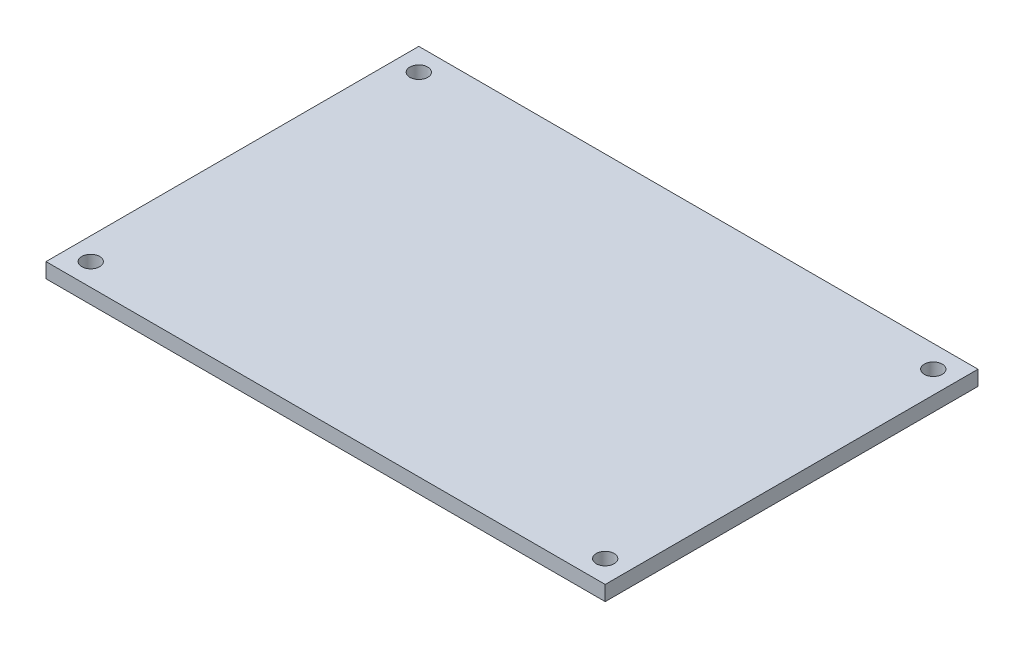
ISO-10303-21;
HEADER;
FILE_DESCRIPTION(('STEP AP214'),'2;1');
FILE_NAME('part.step','',(''),(''),'','','');
FILE_SCHEMA(('AUTOMOTIVE_DESIGN { 1 0 10303 214 1 1 1 1 }'));
ENDSEC;
DATA;
#1=APPLICATION_CONTEXT('core data for automotive mechanical design processes');
#2=APPLICATION_PROTOCOL_DEFINITION('international standard','automotive_design',2000,#1);
#3=PRODUCT_CONTEXT('',#1,'mechanical');
#4=PRODUCT('Part','Part','',(#3));
#5=PRODUCT_RELATED_PRODUCT_CATEGORY('part','',(#4));
#6=PRODUCT_DEFINITION_FORMATION('','',#4);
#7=PRODUCT_DEFINITION_CONTEXT('part definition',#1,'design');
#8=PRODUCT_DEFINITION('design','',#6,#7);
#9=PRODUCT_DEFINITION_SHAPE('','',#8);
#10=(LENGTH_UNIT() NAMED_UNIT(*) SI_UNIT(.MILLI.,.METRE.));
#11=(NAMED_UNIT(*) PLANE_ANGLE_UNIT() SI_UNIT($,.RADIAN.));
#12=(NAMED_UNIT(*) SI_UNIT($,.STERADIAN.) SOLID_ANGLE_UNIT());
#13=UNCERTAINTY_MEASURE_WITH_UNIT(LENGTH_MEASURE(1.E-05),#10,'distance_accuracy_value','');
#14=(GEOMETRIC_REPRESENTATION_CONTEXT(3) GLOBAL_UNCERTAINTY_ASSIGNED_CONTEXT((#13)) GLOBAL_UNIT_ASSIGNED_CONTEXT((#10,
#11,#12)) REPRESENTATION_CONTEXT('',''));
#15=CARTESIAN_POINT('',(0.,0.,0.));
#16=DIRECTION('',(0.,0.,1.));
#17=DIRECTION('',(1.,0.,0.));
#18=AXIS2_PLACEMENT_3D('',#15,#16,#17);
#19=CARTESIAN_POINT('',(0.,10.,0.));
#20=DIRECTION('',(0.,1.,0.));
#21=DIRECTION('',(0.,0.,1.));
#22=AXIS2_PLACEMENT_3D('',#19,#20,#21);
#23=PLANE('',#22);
#24=CARTESIAN_POINT('',(360.,10.,235.));
#25=DIRECTION('',(0.,1.,0.));
#26=DIRECTION('',(0.,0.,-1.));
#27=AXIS2_PLACEMENT_3D('',#24,#25,#26);
#28=CIRCLE('',#27,5.99999999999999);
#29=CARTESIAN_POINT('',(360.,10.,229.));
#30=VERTEX_POINT('',#29);
#31=EDGE_CURVE('E142',#30,#30,#28,.T.);
#32=ORIENTED_EDGE('',*,*,#31,.F.);
#33=EDGE_LOOP('',(#32));
#34=FACE_BOUND('',#33,.T.);
#35=CARTESIAN_POINT('',(360.,10.,15.));
#36=DIRECTION('',(0.,1.,0.));
#37=DIRECTION('',(0.,0.,1.));
#38=AXIS2_PLACEMENT_3D('',#35,#36,#37);
#39=CIRCLE('',#38,5.99999999999999);
#40=CARTESIAN_POINT('',(360.,10.,21.));
#41=VERTEX_POINT('',#40);
#42=EDGE_CURVE('E112',#41,#41,#39,.T.);
#43=ORIENTED_EDGE('',*,*,#42,.F.);
#44=EDGE_LOOP('',(#43));
#45=FACE_BOUND('',#44,.T.);
#46=DIRECTION('',(0.,0.,1.));
#47=VECTOR('',#46,1.);
#48=CARTESIAN_POINT('',(0.,10.,0.));
#49=LINE('',#48,#47);
#50=CARTESIAN_POINT('',(0.,10.,0.));
#51=VERTEX_POINT('',#50);
#52=CARTESIAN_POINT('',(0.,10.,250.));
#53=VERTEX_POINT('',#52);
#54=EDGE_CURVE('E92',#51,#53,#49,.T.);
#55=ORIENTED_EDGE('',*,*,#54,.T.);
#56=DIRECTION('',(1.,0.,0.));
#57=VECTOR('',#56,1.);
#58=CARTESIAN_POINT('',(0.,10.,250.));
#59=LINE('',#58,#57);
#60=CARTESIAN_POINT('',(375.,10.,250.));
#61=VERTEX_POINT('',#60);
#62=EDGE_CURVE('E87',#53,#61,#59,.T.);
#63=ORIENTED_EDGE('',*,*,#62,.T.);
#64=DIRECTION('',(0.,0.,-1.));
#65=VECTOR('',#64,1.);
#66=CARTESIAN_POINT('',(375.,10.,0.));
#67=LINE('',#66,#65);
#68=CARTESIAN_POINT('',(375.,10.,0.));
#69=VERTEX_POINT('',#68);
#70=EDGE_CURVE('E90',#61,#69,#67,.T.);
#71=ORIENTED_EDGE('',*,*,#70,.T.);
#72=DIRECTION('',(-1.,0.,0.));
#73=VECTOR('',#72,1.);
#74=CARTESIAN_POINT('',(0.,10.,0.));
#75=LINE('',#74,#73);
#76=EDGE_CURVE('E57',#69,#51,#75,.T.);
#77=ORIENTED_EDGE('',*,*,#76,.T.);
#78=EDGE_LOOP('',(#55,#63,#71,#77));
#79=FACE_BOUND('',#78,.T.);
#80=CARTESIAN_POINT('',(15.,10.,15.));
#81=DIRECTION('',(0.,1.,0.));
#82=DIRECTION('',(0.,0.,-1.));
#83=AXIS2_PLACEMENT_3D('',#80,#81,#82);
#84=CIRCLE('',#83,5.99999999999999);
#85=CARTESIAN_POINT('',(15.,10.,9.00000000000005));
#86=VERTEX_POINT('',#85);
#87=EDGE_CURVE('E134',#86,#86,#84,.T.);
#88=ORIENTED_EDGE('',*,*,#87,.F.);
#89=EDGE_LOOP('',(#88));
#90=FACE_BOUND('',#89,.T.);
#91=CARTESIAN_POINT('',(15.,10.,235.));
#92=DIRECTION('',(0.,1.,0.));
#93=DIRECTION('',(0.,0.,1.));
#94=AXIS2_PLACEMENT_3D('',#91,#92,#93);
#95=CIRCLE('',#94,5.99999999999999);
#96=CARTESIAN_POINT('',(15.,10.,241.));
#97=VERTEX_POINT('',#96);
#98=EDGE_CURVE('E150',#97,#97,#95,.T.);
#99=ORIENTED_EDGE('',*,*,#98,.F.);
#100=EDGE_LOOP('',(#99));
#101=FACE_BOUND('',#100,.T.);
#102=ADVANCED_FACE('F39',(#34,#45,#79,#90,#101),#23,.T.);
#103=CARTESIAN_POINT('',(0.,0.,0.));
#104=DIRECTION('',(0.,1.,0.));
#105=DIRECTION('',(0.,0.,1.));
#106=AXIS2_PLACEMENT_3D('',#103,#104,#105);
#107=PLANE('',#106);
#108=DIRECTION('',(0.,0.,1.));
#109=VECTOR('',#108,1.);
#110=CARTESIAN_POINT('',(0.,0.,0.));
#111=LINE('',#110,#109);
#112=CARTESIAN_POINT('',(0.,0.,0.));
#113=VERTEX_POINT('',#112);
#114=CARTESIAN_POINT('',(0.,0.,250.));
#115=VERTEX_POINT('',#114);
#116=EDGE_CURVE('E108',#113,#115,#111,.T.);
#117=ORIENTED_EDGE('',*,*,#116,.F.);
#118=DIRECTION('',(-1.,0.,0.));
#119=VECTOR('',#118,1.);
#120=CARTESIAN_POINT('',(0.,0.,0.));
#121=LINE('',#120,#119);
#122=CARTESIAN_POINT('',(375.,0.,0.));
#123=VERTEX_POINT('',#122);
#124=EDGE_CURVE('E80',#123,#113,#121,.T.);
#125=ORIENTED_EDGE('',*,*,#124,.F.);
#126=DIRECTION('',(0.,0.,-1.));
#127=VECTOR('',#126,1.);
#128=CARTESIAN_POINT('',(375.,0.,0.));
#129=LINE('',#128,#127);
#130=CARTESIAN_POINT('',(375.,0.,250.));
#131=VERTEX_POINT('',#130);
#132=EDGE_CURVE('E74',#131,#123,#129,.T.);
#133=ORIENTED_EDGE('',*,*,#132,.F.);
#134=DIRECTION('',(1.,0.,0.));
#135=VECTOR('',#134,1.);
#136=CARTESIAN_POINT('',(0.,0.,250.));
#137=LINE('',#136,#135);
#138=EDGE_CURVE('E97',#115,#131,#137,.T.);
#139=ORIENTED_EDGE('',*,*,#138,.F.);
#140=EDGE_LOOP('',(#117,#125,#133,#139));
#141=FACE_BOUND('',#140,.T.);
#142=CARTESIAN_POINT('',(360.,0.,15.));
#143=DIRECTION('',(0.,1.,0.));
#144=DIRECTION('',(0.,0.,1.));
#145=AXIS2_PLACEMENT_3D('',#142,#143,#144);
#146=CIRCLE('',#145,5.99999999999999);
#147=CARTESIAN_POINT('',(360.,0.,21.));
#148=VERTEX_POINT('',#147);
#149=EDGE_CURVE('E130',#148,#148,#146,.T.);
#150=ORIENTED_EDGE('',*,*,#149,.T.);
#151=EDGE_LOOP('',(#150));
#152=FACE_BOUND('',#151,.T.);
#153=CARTESIAN_POINT('',(15.,0.,15.));
#154=DIRECTION('',(0.,1.,0.));
#155=DIRECTION('',(0.,0.,-1.));
#156=AXIS2_PLACEMENT_3D('',#153,#154,#155);
#157=CIRCLE('',#156,5.99999999999999);
#158=CARTESIAN_POINT('',(15.,0.,9.00000000000005));
#159=VERTEX_POINT('',#158);
#160=EDGE_CURVE('E138',#159,#159,#157,.T.);
#161=ORIENTED_EDGE('',*,*,#160,.T.);
#162=EDGE_LOOP('',(#161));
#163=FACE_BOUND('',#162,.T.);
#164=CARTESIAN_POINT('',(360.,0.,235.));
#165=DIRECTION('',(0.,1.,0.));
#166=DIRECTION('',(0.,0.,-1.));
#167=AXIS2_PLACEMENT_3D('',#164,#165,#166);
#168=CIRCLE('',#167,5.99999999999999);
#169=CARTESIAN_POINT('',(360.,0.,229.));
#170=VERTEX_POINT('',#169);
#171=EDGE_CURVE('E146',#170,#170,#168,.T.);
#172=ORIENTED_EDGE('',*,*,#171,.T.);
#173=EDGE_LOOP('',(#172));
#174=FACE_BOUND('',#173,.T.);
#175=CARTESIAN_POINT('',(15.,0.,235.));
#176=DIRECTION('',(0.,1.,0.));
#177=DIRECTION('',(0.,0.,1.));
#178=AXIS2_PLACEMENT_3D('',#175,#176,#177);
#179=CIRCLE('',#178,5.99999999999999);
#180=CARTESIAN_POINT('',(15.,0.,241.));
#181=VERTEX_POINT('',#180);
#182=EDGE_CURVE('E154',#181,#181,#179,.T.);
#183=ORIENTED_EDGE('',*,*,#182,.T.);
#184=EDGE_LOOP('',(#183));
#185=FACE_BOUND('',#184,.T.);
#186=ADVANCED_FACE('F125',(#141,#152,#163,#174,#185),#107,.F.);
#187=CARTESIAN_POINT('',(0.,10.,0.));
#188=DIRECTION('',(1.,0.,0.));
#189=DIRECTION('',(0.,0.,-1.));
#190=AXIS2_PLACEMENT_3D('',#187,#188,#189);
#191=PLANE('',#190);
#192=ORIENTED_EDGE('',*,*,#116,.T.);
#193=DIRECTION('',(0.,-1.,0.));
#194=VECTOR('',#193,1.);
#195=CARTESIAN_POINT('',(0.,10.,250.));
#196=LINE('',#195,#194);
#197=EDGE_CURVE('E11',#53,#115,#196,.T.);
#198=ORIENTED_EDGE('',*,*,#197,.F.);
#199=ORIENTED_EDGE('',*,*,#54,.F.);
#200=DIRECTION('',(0.,-1.,0.));
#201=VECTOR('',#200,1.);
#202=CARTESIAN_POINT('',(0.,10.,0.));
#203=LINE('',#202,#201);
#204=EDGE_CURVE('E104',#51,#113,#203,.T.);
#205=ORIENTED_EDGE('',*,*,#204,.T.);
#206=EDGE_LOOP('',(#192,#198,#199,#205));
#207=FACE_BOUND('',#206,.T.);
#208=ADVANCED_FACE('F41',(#207),#191,.F.);
#209=CARTESIAN_POINT('',(0.,10.,250.));
#210=DIRECTION('',(0.,0.,-1.));
#211=DIRECTION('',(-1.,0.,0.));
#212=AXIS2_PLACEMENT_3D('',#209,#210,#211);
#213=PLANE('',#212);
#214=ORIENTED_EDGE('',*,*,#138,.T.);
#215=DIRECTION('',(0.,-1.,0.));
#216=VECTOR('',#215,1.);
#217=CARTESIAN_POINT('',(375.,10.,250.));
#218=LINE('',#217,#216);
#219=EDGE_CURVE('E49',#61,#131,#218,.T.);
#220=ORIENTED_EDGE('',*,*,#219,.F.);
#221=ORIENTED_EDGE('',*,*,#62,.F.);
#222=ORIENTED_EDGE('',*,*,#197,.T.);
#223=EDGE_LOOP('',(#214,#220,#221,#222));
#224=FACE_BOUND('',#223,.T.);
#225=ADVANCED_FACE('F96',(#224),#213,.F.);
#226=CARTESIAN_POINT('',(375.,10.,0.));
#227=DIRECTION('',(-1.,0.,0.));
#228=DIRECTION('',(0.,0.,1.));
#229=AXIS2_PLACEMENT_3D('',#226,#227,#228);
#230=PLANE('',#229);
#231=ORIENTED_EDGE('',*,*,#132,.T.);
#232=DIRECTION('',(0.,-1.,0.));
#233=VECTOR('',#232,1.);
#234=CARTESIAN_POINT('',(375.,10.,0.));
#235=LINE('',#234,#233);
#236=EDGE_CURVE('E99',#69,#123,#235,.T.);
#237=ORIENTED_EDGE('',*,*,#236,.F.);
#238=ORIENTED_EDGE('',*,*,#70,.F.);
#239=ORIENTED_EDGE('',*,*,#219,.T.);
#240=EDGE_LOOP('',(#231,#237,#238,#239));
#241=FACE_BOUND('',#240,.T.);
#242=ADVANCED_FACE('F100',(#241),#230,.F.);
#243=CARTESIAN_POINT('',(0.,10.,0.));
#244=DIRECTION('',(0.,0.,1.));
#245=DIRECTION('',(1.,0.,0.));
#246=AXIS2_PLACEMENT_3D('',#243,#244,#245);
#247=PLANE('',#246);
#248=ORIENTED_EDGE('',*,*,#124,.T.);
#249=ORIENTED_EDGE('',*,*,#204,.F.);
#250=ORIENTED_EDGE('',*,*,#76,.F.);
#251=ORIENTED_EDGE('',*,*,#236,.T.);
#252=EDGE_LOOP('',(#248,#249,#250,#251));
#253=FACE_BOUND('',#252,.T.);
#254=ADVANCED_FACE('F122',(#253),#247,.F.);
#255=CARTESIAN_POINT('',(360.,10.,15.));
#256=DIRECTION('',(0.,-1.,0.));
#257=DIRECTION('',(0.,0.,-1.));
#258=AXIS2_PLACEMENT_3D('',#255,#256,#257);
#259=CYLINDRICAL_SURFACE('',#258,5.99999999999999);
#260=ORIENTED_EDGE('',*,*,#42,.T.);
#261=EDGE_LOOP('',(#260));
#262=FACE_BOUND('',#261,.T.);
#263=ORIENTED_EDGE('',*,*,#149,.F.);
#264=EDGE_LOOP('',(#263));
#265=FACE_BOUND('',#264,.T.);
#266=ADVANCED_FACE('F175',(#262,#265),#259,.F.);
#267=CARTESIAN_POINT('',(15.,10.,15.));
#268=DIRECTION('',(0.,-1.,0.));
#269=DIRECTION('',(0.,0.,-1.));
#270=AXIS2_PLACEMENT_3D('',#267,#268,#269);
#271=CYLINDRICAL_SURFACE('',#270,5.99999999999999);
#272=ORIENTED_EDGE('',*,*,#87,.T.);
#273=EDGE_LOOP('',(#272));
#274=FACE_BOUND('',#273,.T.);
#275=ORIENTED_EDGE('',*,*,#160,.F.);
#276=EDGE_LOOP('',(#275));
#277=FACE_BOUND('',#276,.T.);
#278=ADVANCED_FACE('F221',(#274,#277),#271,.F.);
#279=CARTESIAN_POINT('',(360.,10.,235.));
#280=DIRECTION('',(0.,-1.,0.));
#281=DIRECTION('',(0.,0.,-1.));
#282=AXIS2_PLACEMENT_3D('',#279,#280,#281);
#283=CYLINDRICAL_SURFACE('',#282,5.99999999999999);
#284=ORIENTED_EDGE('',*,*,#31,.T.);
#285=EDGE_LOOP('',(#284));
#286=FACE_BOUND('',#285,.T.);
#287=ORIENTED_EDGE('',*,*,#171,.F.);
#288=EDGE_LOOP('',(#287));
#289=FACE_BOUND('',#288,.T.);
#290=ADVANCED_FACE('F229',(#286,#289),#283,.F.);
#291=CARTESIAN_POINT('',(15.,10.,235.));
#292=DIRECTION('',(0.,-1.,0.));
#293=DIRECTION('',(0.,0.,-1.));
#294=AXIS2_PLACEMENT_3D('',#291,#292,#293);
#295=CYLINDRICAL_SURFACE('',#294,5.99999999999999);
#296=ORIENTED_EDGE('',*,*,#98,.T.);
#297=EDGE_LOOP('',(#296));
#298=FACE_BOUND('',#297,.T.);
#299=ORIENTED_EDGE('',*,*,#182,.F.);
#300=EDGE_LOOP('',(#299));
#301=FACE_BOUND('',#300,.T.);
#302=ADVANCED_FACE('F162',(#298,#301),#295,.F.);
#303=CLOSED_SHELL('',(#102,#186,#208,#225,#242,#254,#266,#278,#290,#302));
#304=MANIFOLD_SOLID_BREP('B2',#303);
#305=ADVANCED_BREP_SHAPE_REPRESENTATION('',(#18,#304),#14);
#306=SHAPE_DEFINITION_REPRESENTATION(#9,#305);
ENDSEC;
END-ISO-10303-21;
